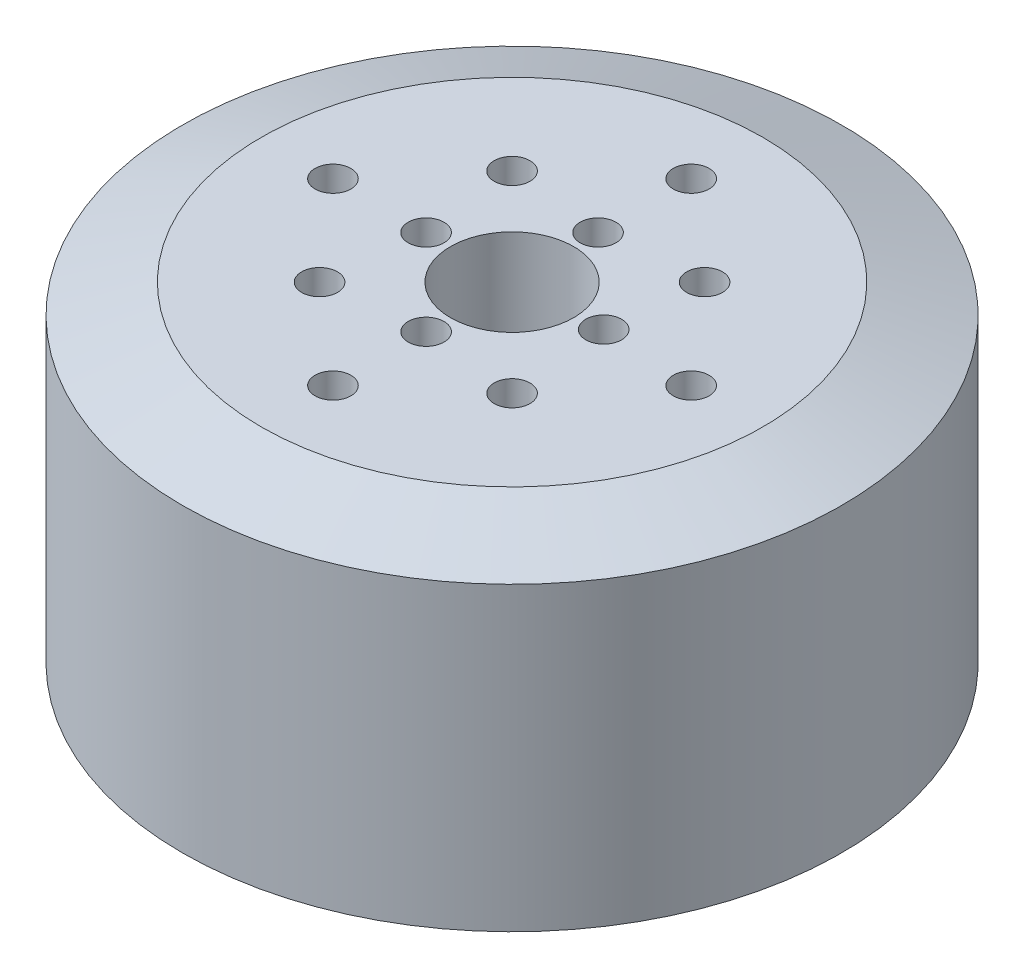
ISO-10303-21;
HEADER;
FILE_DESCRIPTION(('STEP AP214'),'2;1');
FILE_NAME('part.step','',(''),(''),'','','');
FILE_SCHEMA(('AUTOMOTIVE_DESIGN { 1 0 10303 214 1 1 1 1 }'));
ENDSEC;
DATA;
#1=APPLICATION_CONTEXT('core data for automotive mechanical design processes');
#2=APPLICATION_PROTOCOL_DEFINITION('international standard','automotive_design',2000,#1);
#3=PRODUCT_CONTEXT('',#1,'mechanical');
#4=PRODUCT('Part','Part','',(#3));
#5=PRODUCT_RELATED_PRODUCT_CATEGORY('part','',(#4));
#6=PRODUCT_DEFINITION_FORMATION('','',#4);
#7=PRODUCT_DEFINITION_CONTEXT('part definition',#1,'design');
#8=PRODUCT_DEFINITION('design','',#6,#7);
#9=PRODUCT_DEFINITION_SHAPE('','',#8);
#10=(LENGTH_UNIT() NAMED_UNIT(*) SI_UNIT(.MILLI.,.METRE.));
#11=(NAMED_UNIT(*) PLANE_ANGLE_UNIT() SI_UNIT($,.RADIAN.));
#12=(NAMED_UNIT(*) SI_UNIT($,.STERADIAN.) SOLID_ANGLE_UNIT());
#13=UNCERTAINTY_MEASURE_WITH_UNIT(LENGTH_MEASURE(1.E-05),#10,'distance_accuracy_value','');
#14=(GEOMETRIC_REPRESENTATION_CONTEXT(3) GLOBAL_UNCERTAINTY_ASSIGNED_CONTEXT((#13)) GLOBAL_UNIT_ASSIGNED_CONTEXT((#10,
#11,#12)) REPRESENTATION_CONTEXT('',''));
#15=CARTESIAN_POINT('',(0.,0.,0.));
#16=DIRECTION('',(0.,0.,1.));
#17=DIRECTION('',(1.,0.,0.));
#18=AXIS2_PLACEMENT_3D('',#15,#16,#17);
#19=CARTESIAN_POINT('',(0.,0.,0.));
#20=DIRECTION('',(0.,1.,0.));
#21=DIRECTION('',(0.,0.,1.));
#22=AXIS2_PLACEMENT_3D('',#19,#20,#21);
#23=CYLINDRICAL_SURFACE('',#22,3.5);
#24=CARTESIAN_POINT('',(0.,-9.,0.));
#25=DIRECTION('',(0.,1.,0.));
#26=DIRECTION('',(0.,0.,1.));
#27=AXIS2_PLACEMENT_3D('',#24,#25,#26);
#28=CIRCLE('',#27,3.5);
#29=CARTESIAN_POINT('',(0.,-9.,3.5));
#30=VERTEX_POINT('',#29);
#31=EDGE_CURVE('E162',#30,#30,#28,.T.);
#32=ORIENTED_EDGE('',*,*,#31,.F.);
#33=EDGE_LOOP('',(#32));
#34=FACE_BOUND('',#33,.T.);
#35=CARTESIAN_POINT('',(0.,-2.,0.));
#36=DIRECTION('',(0.,1.,0.));
#37=DIRECTION('',(0.,0.,1.));
#38=AXIS2_PLACEMENT_3D('',#35,#36,#37);
#39=CIRCLE('',#38,3.5);
#40=CARTESIAN_POINT('',(0.,-2.,3.5));
#41=VERTEX_POINT('',#40);
#42=EDGE_CURVE('E42',#41,#41,#39,.F.);
#43=ORIENTED_EDGE('',*,*,#42,.F.);
#44=EDGE_LOOP('',(#43));
#45=FACE_BOUND('',#44,.T.);
#46=ADVANCED_FACE('F38',(#34,#45),#23,.F.);
#47=CARTESIAN_POINT('',(0.,23.,0.));
#48=DIRECTION('',(0.,-1.,0.));
#49=DIRECTION('',(0.,0.,-1.));
#50=AXIS2_PLACEMENT_3D('',#47,#48,#49);
#51=CYLINDRICAL_SURFACE('',#50,23.);
#52=CARTESIAN_POINT('',(0.,21.,0.));
#53=DIRECTION('',(0.,1.,0.));
#54=DIRECTION('',(0.,0.,1.));
#55=AXIS2_PLACEMENT_3D('',#52,#53,#54);
#56=CIRCLE('',#55,23.);
#57=CARTESIAN_POINT('',(0.,21.,23.));
#58=VERTEX_POINT('',#57);
#59=EDGE_CURVE('E176',#58,#58,#56,.F.);
#60=ORIENTED_EDGE('',*,*,#59,.T.);
#61=EDGE_LOOP('',(#60));
#62=FACE_BOUND('',#61,.T.);
#63=CARTESIAN_POINT('',(0.,0.,0.));
#64=DIRECTION('',(0.,1.,0.));
#65=DIRECTION('',(0.,0.,1.));
#66=AXIS2_PLACEMENT_3D('',#63,#64,#65);
#67=CIRCLE('',#66,23.);
#68=CARTESIAN_POINT('',(0.,0.,23.));
#69=VERTEX_POINT('',#68);
#70=EDGE_CURVE('E170',#69,#69,#67,.T.);
#71=ORIENTED_EDGE('',*,*,#70,.T.);
#72=EDGE_LOOP('',(#71));
#73=FACE_BOUND('',#72,.T.);
#74=ADVANCED_FACE('F238',(#62,#73),#51,.T.);
#75=CARTESIAN_POINT('',(0.,23.,0.));
#76=DIRECTION('',(0.,1.,0.));
#77=DIRECTION('',(0.,0.,1.));
#78=AXIS2_PLACEMENT_3D('',#75,#76,#77);
#79=PLANE('',#78);
#80=CARTESIAN_POINT('',(0.,23.,0.));
#81=DIRECTION('',(0.,1.,0.));
#82=DIRECTION('',(0.,0.,1.));
#83=AXIS2_PLACEMENT_3D('',#80,#81,#82);
#84=CIRCLE('',#83,4.3);
#85=CARTESIAN_POINT('',(0.,23.,4.3));
#86=VERTEX_POINT('',#85);
#87=EDGE_CURVE('E494',#86,#86,#84,.T.);
#88=ORIENTED_EDGE('',*,*,#87,.F.);
#89=EDGE_LOOP('',(#88));
#90=FACE_BOUND('',#89,.T.);
#91=CARTESIAN_POINT('',(-6.7175144212721,23.,-6.71751442127231));
#92=DIRECTION('',(0.,1.,0.));
#93=DIRECTION('',(0.,0.,1.));
#94=AXIS2_PLACEMENT_3D('',#91,#92,#93);
#95=CIRCLE('',#94,1.24999999999999);
#96=CARTESIAN_POINT('',(-6.7175144212721,23.,-5.46751442127232));
#97=VERTEX_POINT('',#96);
#98=EDGE_CURVE('E483',#97,#97,#95,.T.);
#99=ORIENTED_EDGE('',*,*,#98,.F.);
#100=EDGE_LOOP('',(#99));
#101=FACE_BOUND('',#100,.T.);
#102=CARTESIAN_POINT('',(6.71751442127224,23.,-6.71751442127216));
#103=DIRECTION('',(0.,1.,0.));
#104=DIRECTION('',(0.,0.,1.));
#105=AXIS2_PLACEMENT_3D('',#102,#103,#104);
#106=CIRCLE('',#105,1.24999999999999);
#107=CARTESIAN_POINT('',(6.71751442127224,23.,-5.46751442127218));
#108=VERTEX_POINT('',#107);
#109=EDGE_CURVE('E480',#108,#108,#106,.T.);
#110=ORIENTED_EDGE('',*,*,#109,.F.);
#111=EDGE_LOOP('',(#110));
#112=FACE_BOUND('',#111,.T.);
#113=CARTESIAN_POINT('',(6.71751442127216,23.,6.71751442127224));
#114=DIRECTION('',(0.,1.,0.));
#115=DIRECTION('',(0.,0.,1.));
#116=AXIS2_PLACEMENT_3D('',#113,#114,#115);
#117=CIRCLE('',#116,1.24999999999999);
#118=CARTESIAN_POINT('',(6.71751442127216,23.,7.96751442127222));
#119=VERTEX_POINT('',#118);
#120=EDGE_CURVE('E477',#119,#119,#117,.T.);
#121=ORIENTED_EDGE('',*,*,#120,.F.);
#122=EDGE_LOOP('',(#121));
#123=FACE_BOUND('',#122,.T.);
#124=CARTESIAN_POINT('',(-6.71751442127224,23.,6.71751442127217));
#125=DIRECTION('',(0.,1.,0.));
#126=DIRECTION('',(0.,0.,1.));
#127=AXIS2_PLACEMENT_3D('',#124,#125,#126);
#128=CIRCLE('',#127,1.24999999999999);
#129=CARTESIAN_POINT('',(-6.71751442127224,23.,7.96751442127215));
#130=VERTEX_POINT('',#129);
#131=EDGE_CURVE('E473',#130,#130,#128,.T.);
#132=ORIENTED_EDGE('',*,*,#131,.F.);
#133=EDGE_LOOP('',(#132));
#134=FACE_BOUND('',#133,.T.);
#135=CARTESIAN_POINT('',(6.06215920614872,23.,-0.332038967862047));
#136=DIRECTION('',(0.,1.,0.));
#137=DIRECTION('',(0.,0.,1.));
#138=AXIS2_PLACEMENT_3D('',#135,#136,#137);
#139=CIRCLE('',#138,1.24999999999999);
#140=CARTESIAN_POINT('',(6.06215920614872,23.,0.917961032137942));
#141=VERTEX_POINT('',#140);
#142=EDGE_CURVE('E112',#141,#141,#139,.T.);
#143=ORIENTED_EDGE('',*,*,#142,.F.);
#144=EDGE_LOOP('',(#143));
#145=FACE_BOUND('',#144,.T.);
#146=CARTESIAN_POINT('',(0.,23.,-6.));
#147=DIRECTION('',(0.,1.,0.));
#148=DIRECTION('',(0.,0.,1.));
#149=AXIS2_PLACEMENT_3D('',#146,#147,#148);
#150=CIRCLE('',#149,1.24999999999999);
#151=CARTESIAN_POINT('',(0.,23.,-4.75000000000001));
#152=VERTEX_POINT('',#151);
#153=EDGE_CURVE('E120',#152,#152,#150,.T.);
#154=ORIENTED_EDGE('',*,*,#153,.F.);
#155=EDGE_LOOP('',(#154));
#156=FACE_BOUND('',#155,.T.);
#157=CARTESIAN_POINT('',(-6.,23.,0.));
#158=DIRECTION('',(0.,1.,0.));
#159=DIRECTION('',(0.,0.,1.));
#160=AXIS2_PLACEMENT_3D('',#157,#158,#159);
#161=CIRCLE('',#160,1.24999999999999);
#162=CARTESIAN_POINT('',(-6.,23.,1.24999999999999));
#163=VERTEX_POINT('',#162);
#164=EDGE_CURVE('E127',#163,#163,#161,.T.);
#165=ORIENTED_EDGE('',*,*,#164,.F.);
#166=EDGE_LOOP('',(#165));
#167=FACE_BOUND('',#166,.T.);
#168=CARTESIAN_POINT('',(0.,23.,6.));
#169=DIRECTION('',(0.,1.,0.));
#170=DIRECTION('',(0.,0.,1.));
#171=AXIS2_PLACEMENT_3D('',#168,#169,#170);
#172=CIRCLE('',#171,1.24999999999999);
#173=CARTESIAN_POINT('',(0.,23.,7.24999999999999));
#174=VERTEX_POINT('',#173);
#175=EDGE_CURVE('E132',#174,#174,#172,.T.);
#176=ORIENTED_EDGE('',*,*,#175,.F.);
#177=EDGE_LOOP('',(#176));
#178=FACE_BOUND('',#177,.T.);
#179=CARTESIAN_POINT('',(0.,23.,-12.5));
#180=DIRECTION('',(0.,1.,0.));
#181=DIRECTION('',(0.,0.,1.));
#182=AXIS2_PLACEMENT_3D('',#179,#180,#181);
#183=CIRCLE('',#182,1.24999999999999);
#184=CARTESIAN_POINT('',(0.,23.,-11.25));
#185=VERTEX_POINT('',#184);
#186=EDGE_CURVE('E137',#185,#185,#183,.T.);
#187=ORIENTED_EDGE('',*,*,#186,.F.);
#188=EDGE_LOOP('',(#187));
#189=FACE_BOUND('',#188,.T.);
#190=CARTESIAN_POINT('',(12.5,23.,0.));
#191=DIRECTION('',(0.,1.,0.));
#192=DIRECTION('',(0.,0.,1.));
#193=AXIS2_PLACEMENT_3D('',#190,#191,#192);
#194=CIRCLE('',#193,1.24999999999999);
#195=CARTESIAN_POINT('',(12.5,23.,1.24999999999999));
#196=VERTEX_POINT('',#195);
#197=EDGE_CURVE('E141',#196,#196,#194,.T.);
#198=ORIENTED_EDGE('',*,*,#197,.F.);
#199=EDGE_LOOP('',(#198));
#200=FACE_BOUND('',#199,.T.);
#201=CARTESIAN_POINT('',(0.,23.,12.5));
#202=DIRECTION('',(0.,1.,0.));
#203=DIRECTION('',(0.,0.,1.));
#204=AXIS2_PLACEMENT_3D('',#201,#202,#203);
#205=CIRCLE('',#204,1.24999999999999);
#206=CARTESIAN_POINT('',(0.,23.,13.75));
#207=VERTEX_POINT('',#206);
#208=EDGE_CURVE('E145',#207,#207,#205,.T.);
#209=ORIENTED_EDGE('',*,*,#208,.F.);
#210=EDGE_LOOP('',(#209));
#211=FACE_BOUND('',#210,.T.);
#212=CARTESIAN_POINT('',(-12.5,23.,0.));
#213=DIRECTION('',(0.,1.,0.));
#214=DIRECTION('',(0.,0.,1.));
#215=AXIS2_PLACEMENT_3D('',#212,#213,#214);
#216=CIRCLE('',#215,1.24999999999999);
#217=CARTESIAN_POINT('',(-12.5,23.,1.24999999999999));
#218=VERTEX_POINT('',#217);
#219=EDGE_CURVE('E149',#218,#218,#216,.T.);
#220=ORIENTED_EDGE('',*,*,#219,.F.);
#221=EDGE_LOOP('',(#220));
#222=FACE_BOUND('',#221,.T.);
#223=CARTESIAN_POINT('',(0.,23.,0.));
#224=DIRECTION('',(0.,1.,0.));
#225=DIRECTION('',(0.,0.,1.));
#226=AXIS2_PLACEMENT_3D('',#223,#224,#225);
#227=CIRCLE('',#226,17.5050451610907);
#228=CARTESIAN_POINT('',(0.,23.,17.5050451610907));
#229=VERTEX_POINT('',#228);
#230=EDGE_CURVE('E173',#229,#229,#227,.T.);
#231=ORIENTED_EDGE('',*,*,#230,.T.);
#232=EDGE_LOOP('',(#231));
#233=FACE_BOUND('',#232,.T.);
#234=ADVANCED_FACE('F243',(#90,#101,#112,#123,#134,#145,#156,#167,#178,#189,#200,#211,#222,
#233),#79,.T.);
#235=CARTESIAN_POINT('',(0.,0.,0.));
#236=DIRECTION('',(0.,1.,0.));
#237=DIRECTION('',(0.,0.,1.));
#238=AXIS2_PLACEMENT_3D('',#235,#236,#237);
#239=PLANE('',#238);
#240=CARTESIAN_POINT('',(0.,0.,0.));
#241=DIRECTION('',(0.,-1.,0.));
#242=DIRECTION('',(0.,0.,-1.));
#243=AXIS2_PLACEMENT_3D('',#240,#241,#242);
#244=CIRCLE('',#243,21.);
#245=CARTESIAN_POINT('',(0.,0.,-21.));
#246=VERTEX_POINT('',#245);
#247=EDGE_CURVE('E156',#246,#246,#244,.T.);
#248=ORIENTED_EDGE('',*,*,#247,.F.);
#249=EDGE_LOOP('',(#248));
#250=FACE_BOUND('',#249,.T.);
#251=ORIENTED_EDGE('',*,*,#70,.F.);
#252=EDGE_LOOP('',(#251));
#253=FACE_BOUND('',#252,.T.);
#254=ADVANCED_FACE('F250',(#250,#253),#239,.F.);
#255=CARTESIAN_POINT('',(0.,23.,0.));
#256=DIRECTION('',(0.,-1.,0.));
#257=DIRECTION('',(0.,0.,-1.));
#258=AXIS2_PLACEMENT_3D('',#255,#256,#257);
#259=CONICAL_SURFACE('',#258,17.5050451610907,1.22173047639603);
#260=ORIENTED_EDGE('',*,*,#59,.F.);
#261=EDGE_LOOP('',(#260));
#262=FACE_BOUND('',#261,.T.);
#263=ORIENTED_EDGE('',*,*,#230,.F.);
#264=EDGE_LOOP('',(#263));
#265=FACE_BOUND('',#264,.T.);
#266=ADVANCED_FACE('F40',(#262,#265),#259,.T.);
#267=CARTESIAN_POINT('',(0.,-9.,0.));
#268=DIRECTION('',(0.,1.,0.));
#269=DIRECTION('',(0.,0.,1.));
#270=AXIS2_PLACEMENT_3D('',#267,#268,#269);
#271=CYLINDRICAL_SURFACE('',#270,5.);
#272=DIRECTION('',(0.,1.,0.));
#273=VECTOR('',#272,1.);
#274=CARTESIAN_POINT('',(4.92648039244466,19.25,-0.854278024333036));
#275=LINE('',#274,#273);
#276=CARTESIAN_POINT('',(4.92648039244465,15.5,-0.854278024333037));
#277=VERTEX_POINT('',#276);
#278=CARTESIAN_POINT('',(4.92648039244466,19.,-0.854278024333036));
#279=VERTEX_POINT('',#278);
#280=EDGE_CURVE('E55',#277,#279,#275,.T.);
#281=ORIENTED_EDGE('',*,*,#280,.F.);
#282=CARTESIAN_POINT('',(4.99027501462058,15.5002000000004,0.311697414897239));
#283=CARTESIAN_POINT('',(4.99360552216487,15.4820059849964,0.258424595256702));
#284=CARTESIAN_POINT('',(4.99611722470376,15.4654009108554,0.204450863679389));
#285=CARTESIAN_POINT('',(4.99939543873086,15.4365060868304,0.0950931019042687));
#286=CARTESIAN_POINT('',(5.00015493933427,15.4242338385591,0.0397042996734908));
#287=CARTESIAN_POINT('',(4.99979978031538,15.4056763303057,-0.069880293194446));
#288=CARTESIAN_POINT('',(4.99875716836379,15.399175937336,-0.124038174089908));
#289=CARTESIAN_POINT('',(4.99488204454086,15.3921743451514,-0.232578303083335));
#290=CARTESIAN_POINT('',(4.99205335362825,15.3916603846934,-0.286959826621077));
#291=CARTESIAN_POINT('',(4.98538573684323,15.3961553094821,-0.384475003286181));
#292=CARTESIAN_POINT('',(4.98186155654648,15.4000812992085,-0.427685170301955));
#293=CARTESIAN_POINT('',(4.97374456704113,15.4114584673814,-0.513541004473429));
#294=CARTESIAN_POINT('',(4.96915149412868,15.4189105162028,-0.556186529579292));
#295=CARTESIAN_POINT('',(4.95879349089047,15.437127750021,-0.642108296478677));
#296=CARTESIAN_POINT('',(4.95299460868225,15.4479950713087,-0.68535819515262));
#297=CARTESIAN_POINT('',(4.94041083976459,15.4723121258251,-0.770845309424624));
#298=CARTESIAN_POINT('',(4.93362890828868,15.4857541565982,-0.813085133126015));
#299=CARTESIAN_POINT('',(4.92638007325319,15.5002000000053,-0.854856346910934));
#300=B_SPLINE_CURVE_WITH_KNOTS('',3,(#282,#283,#284,#285,#286,#287,#288,#289,#290,#291,#292,
#293,#294,#295,#296,#297,#298,#299),.UNSPECIFIED.,.F.,.F.,(4,2,2,2,2,2,2,2,4),(0.,
0.169301112032795,0.339278463055959,0.50261633672497,0.665605960122337,0.796031842358435,
0.926489935816234,1.06129563521788,1.19570417902296),.UNSPECIFIED.);
#301=CARTESIAN_POINT('',(4.99031157095918,15.5,0.311111595333371));
#302=VERTEX_POINT('',#301);
#303=EDGE_CURVE('E11',#302,#277,#300,.T.);
#304=ORIENTED_EDGE('',*,*,#303,.F.);
#305=DIRECTION('',(0.,1.,0.));
#306=VECTOR('',#305,1.);
#307=CARTESIAN_POINT('',(4.99031157095918,19.25,0.31111159533337));
#308=LINE('',#307,#306);
#309=CARTESIAN_POINT('',(4.99031157095918,19.,0.31111159533337));
#310=VERTEX_POINT('',#309);
#311=EDGE_CURVE('E111',#310,#302,#308,.F.);
#312=ORIENTED_EDGE('',*,*,#311,.F.);
#313=CARTESIAN_POINT('',(0.,19.,0.));
#314=DIRECTION('',(0.,-1.,0.));
#315=DIRECTION('',(0.,0.,-1.));
#316=AXIS2_PLACEMENT_3D('',#313,#314,#315);
#317=CIRCLE('',#316,5.);
#318=CARTESIAN_POINT('',(0.683046656074812,19.,4.953125));
#319=VERTEX_POINT('',#318);
#320=EDGE_CURVE('E158',#310,#319,#317,.T.);
#321=ORIENTED_EDGE('',*,*,#320,.T.);
#322=DIRECTION('',(0.,1.,0.));
#323=VECTOR('',#322,1.);
#324=CARTESIAN_POINT('',(0.683046656074812,19.25,4.953125));
#325=LINE('',#324,#323);
#326=CARTESIAN_POINT('',(0.683046656074819,15.5,4.953125));
#327=VERTEX_POINT('',#326);
#328=EDGE_CURVE('E598',#327,#319,#325,.T.);
#329=ORIENTED_EDGE('',*,*,#328,.F.);
#330=CARTESIAN_POINT('',(-0.68354939084132,15.5002,4.95305564578882));
#331=CARTESIAN_POINT('',(-0.63049596911567,15.4791312856344,4.96037548903329));
#332=CARTESIAN_POINT('',(-0.57673545863239,15.4593113819134,4.96692758343031));
#333=CARTESIAN_POINT('',(-0.467466646189805,15.4233891805751,4.97840509830115));
#334=CARTESIAN_POINT('',(-0.411949703203379,15.4073102251416,4.98332038360211));
#335=CARTESIAN_POINT('',(-0.300631984845447,15.3806547283435,4.99125875159246));
#336=CARTESIAN_POINT('',(-0.244860339074458,15.3699721824375,4.99431854560324));
#337=CARTESIAN_POINT('',(-0.132507045841449,15.3550078584312,4.99855861325173));
#338=CARTESIAN_POINT('',(-0.0759279808631046,15.3507089395087,4.99974392067491));
#339=CARTESIAN_POINT('',(0.0315230703155169,15.3492102636196,5.00015914885173));
#340=CARTESIAN_POINT('',(0.0823854156290366,15.3513278153558,4.99957709667599));
#341=CARTESIAN_POINT('',(0.183596368344055,15.3609297505612,4.9968849623259));
#342=CARTESIAN_POINT('',(0.233944371651127,15.3684198410474,4.99477325524132));
#343=CARTESIAN_POINT('',(0.333676678586855,15.3879331937142,4.98910406516098));
#344=CARTESIAN_POINT('',(0.383060286379363,15.3999596104679,4.98554557593474));
#345=CARTESIAN_POINT('',(0.480677992098879,15.4275336004237,4.97708239997955));
#346=CARTESIAN_POINT('',(0.528912478660019,15.4430799639412,4.97217817561104));
#347=CARTESIAN_POINT('',(0.594595391132845,15.4663124351049,4.96455282167522));
#348=CARTESIAN_POINT('',(0.612519621872725,15.4728682787442,4.96237277837279));
#349=CARTESIAN_POINT('',(0.648168900608865,15.4863000604369,4.95784216146103));
#350=CARTESIAN_POINT('',(0.66589436175369,15.4931750652896,4.95549207501973));
#351=CARTESIAN_POINT('',(0.683549390842156,15.5002000000003,4.9530556457887));
#352=B_SPLINE_CURVE_WITH_KNOTS('',3,(#330,#331,#332,#333,#334,#335,#336,#337,#338,#339,#340,
#341,#342,#343,#344,#345,#346,#347,#348,#349,#350,#351),.UNSPECIFIED.,.F.,.F.,(4,2,2,2,2,2,2,2,
2,2,4),(0.,0.172779897582075,0.346610579252038,0.516879087408299,0.686689571756135,
0.839089218335956,0.991650992713053,1.14431905512536,1.29693473019882,1.35456095359918,
1.41202816092007),.UNSPECIFIED.);
#353=CARTESIAN_POINT('',(-0.683046656074818,15.5,4.953125));
#354=VERTEX_POINT('',#353);
#355=EDGE_CURVE('E179',#354,#327,#352,.T.);
#356=ORIENTED_EDGE('',*,*,#355,.F.);
#357=DIRECTION('',(0.,1.,0.));
#358=VECTOR('',#357,1.);
#359=CARTESIAN_POINT('',(-0.683046656074812,19.25,4.953125));
#360=LINE('',#359,#358);
#361=CARTESIAN_POINT('',(-0.683046656074812,19.,4.953125));
#362=VERTEX_POINT('',#361);
#363=EDGE_CURVE('E194',#362,#354,#360,.F.);
#364=ORIENTED_EDGE('',*,*,#363,.F.);
#365=CARTESIAN_POINT('',(-4.953125,19.,0.683046656074812));
#366=VERTEX_POINT('',#365);
#367=EDGE_CURVE('E153',#362,#366,#317,.T.);
#368=ORIENTED_EDGE('',*,*,#367,.T.);
#369=DIRECTION('',(0.,1.,0.));
#370=VECTOR('',#369,1.);
#371=CARTESIAN_POINT('',(-4.953125,19.25,0.683046656074812));
#372=LINE('',#371,#370);
#373=CARTESIAN_POINT('',(-4.953125,15.5,0.683046656074819));
#374=VERTEX_POINT('',#373);
#375=EDGE_CURVE('E585',#374,#366,#372,.T.);
#376=ORIENTED_EDGE('',*,*,#375,.F.);
#377=CARTESIAN_POINT('',(-4.95305564578882,15.5002,-0.68354939084132));
#378=CARTESIAN_POINT('',(-4.96037548903329,15.4791312856344,-0.63049596911567));
#379=CARTESIAN_POINT('',(-4.96692758343031,15.4593113819134,-0.57673545863239));
#380=CARTESIAN_POINT('',(-4.97840509830115,15.4233891805751,-0.467466646189805));
#381=CARTESIAN_POINT('',(-4.98332038360211,15.4073102251416,-0.411949703203379));
#382=CARTESIAN_POINT('',(-4.99125875159246,15.3806547283435,-0.300631984845447));
#383=CARTESIAN_POINT('',(-4.99431854560324,15.3699721824375,-0.244860339074457));
#384=CARTESIAN_POINT('',(-4.99855861325173,15.3550078584312,-0.132507045841449));
#385=CARTESIAN_POINT('',(-4.99974392067491,15.3507089395087,-0.0759279808631038));
#386=CARTESIAN_POINT('',(-5.00015914885173,15.3492102636196,0.0315230703155177));
#387=CARTESIAN_POINT('',(-4.99957709667599,15.3513278153558,0.0823854156290372));
#388=CARTESIAN_POINT('',(-4.9968849623259,15.3609297505612,0.183596368344055));
#389=CARTESIAN_POINT('',(-4.99477325524132,15.3684198410474,0.233944371651127));
#390=CARTESIAN_POINT('',(-4.98910406516098,15.3879331937142,0.333676678586855));
#391=CARTESIAN_POINT('',(-4.98554557593474,15.3999596104679,0.383060286379362));
#392=CARTESIAN_POINT('',(-4.97708239997955,15.4275336004237,0.480677992098879));
#393=CARTESIAN_POINT('',(-4.97217817561104,15.4430799639412,0.528912478660018));
#394=CARTESIAN_POINT('',(-4.96455282167522,15.4663124351049,0.594595391132844));
#395=CARTESIAN_POINT('',(-4.96237277837279,15.4728682787442,0.612519621872725));
#396=CARTESIAN_POINT('',(-4.95784216146103,15.4863000604369,0.648168900608865));
#397=CARTESIAN_POINT('',(-4.95549207501973,15.4931750652896,0.665894361753689));
#398=CARTESIAN_POINT('',(-4.9530556457887,15.5002000000003,0.683549390842156));
#399=B_SPLINE_CURVE_WITH_KNOTS('',3,(#377,#378,#379,#380,#381,#382,#383,#384,#385,#386,#387,
#388,#389,#390,#391,#392,#393,#394,#395,#396,#397,#398),.UNSPECIFIED.,.F.,.F.,(4,2,2,2,2,2,2,2,
2,2,4),(0.,0.172779897582075,0.346610579252038,0.516879087408299,0.686689571756136,
0.839089218335956,0.991650992713053,1.14431905512536,1.29693473019881,1.35456095359918,
1.41202816092007),.UNSPECIFIED.);
#400=CARTESIAN_POINT('',(-4.953125,15.5,-0.683046656074818));
#401=VERTEX_POINT('',#400);
#402=EDGE_CURVE('E576',#401,#374,#399,.T.);
#403=ORIENTED_EDGE('',*,*,#402,.F.);
#404=DIRECTION('',(0.,1.,0.));
#405=VECTOR('',#404,1.);
#406=CARTESIAN_POINT('',(-4.953125,19.25,-0.683046656074812));
#407=LINE('',#406,#405);
#408=CARTESIAN_POINT('',(-4.953125,19.,-0.683046656074812));
#409=VERTEX_POINT('',#408);
#410=EDGE_CURVE('E582',#409,#401,#407,.F.);
#411=ORIENTED_EDGE('',*,*,#410,.F.);
#412=CARTESIAN_POINT('',(-0.683046656074812,19.,-4.953125));
#413=VERTEX_POINT('',#412);
#414=EDGE_CURVE('E157',#409,#413,#317,.T.);
#415=ORIENTED_EDGE('',*,*,#414,.T.);
#416=DIRECTION('',(0.,1.,0.));
#417=VECTOR('',#416,1.);
#418=CARTESIAN_POINT('',(-0.683046656074812,19.25,-4.953125));
#419=LINE('',#418,#417);
#420=CARTESIAN_POINT('',(-0.683046656074819,15.5,-4.953125));
#421=VERTEX_POINT('',#420);
#422=EDGE_CURVE('E561',#421,#413,#419,.T.);
#423=ORIENTED_EDGE('',*,*,#422,.F.);
#424=CARTESIAN_POINT('',(0.683549390842154,15.5002000000003,-4.9530556457887));
#425=CARTESIAN_POINT('',(0.63049596911649,15.4791312856348,-4.96037548903319));
#426=CARTESIAN_POINT('',(0.576735458633196,15.4593113819137,-4.96692758343021));
#427=CARTESIAN_POINT('',(0.467466646190582,15.4233891805754,-4.97840509830107));
#428=CARTESIAN_POINT('',(0.411949703204141,15.4073102251418,-4.98332038360204));
#429=CARTESIAN_POINT('',(0.300631984846175,15.3806547283436,-4.99125875159241));
#430=CARTESIAN_POINT('',(0.244860339075166,15.3699721824376,-4.9943185456032));
#431=CARTESIAN_POINT('',(0.132507045842115,15.3550078584312,-4.99855861325171));
#432=CARTESIAN_POINT('',(0.0759279808637474,15.3507089395087,-4.9997439206749));
#433=CARTESIAN_POINT('',(-0.0315230703149446,15.3492102636195,-5.00015914885173));
#434=CARTESIAN_POINT('',(-0.0823854156285113,15.3513278153558,-4.999577096676));
#435=CARTESIAN_POINT('',(-0.183596368343624,15.3609297505612,-4.99688496232592));
#436=CARTESIAN_POINT('',(-0.233944371650744,15.3684198410474,-4.99477325524133));
#437=CARTESIAN_POINT('',(-0.333676678586566,15.3879331937141,-4.989104065161));
#438=CARTESIAN_POINT('',(-0.383060286379119,15.3999596104678,-4.98554557593476));
#439=CARTESIAN_POINT('',(-0.480677992098724,15.4275336004236,-4.97708239997956));
#440=CARTESIAN_POINT('',(-0.528912478659907,15.4430799639412,-4.97217817561105));
#441=CARTESIAN_POINT('',(-0.594595391132645,15.4663124351048,-4.96455282167524));
#442=CARTESIAN_POINT('',(-0.612519621872397,15.4728682787441,-4.96237277837283));
#443=CARTESIAN_POINT('',(-0.648168900608282,15.4863000604367,-4.95784216146111));
#444=CARTESIAN_POINT('',(-0.66589436175298,15.4931750652893,-4.95549207501983));
#445=CARTESIAN_POINT('',(-0.683549390841322,15.5002,-4.95305564578882));
#446=B_SPLINE_CURVE_WITH_KNOTS('',3,(#424,#425,#426,#427,#428,#429,#430,#431,#432,#433,#434,
#435,#436,#437,#438,#439,#440,#441,#442,#443,#444,#445),.UNSPECIFIED.,.F.,.F.,(4,2,2,2,2,2,2,2,
2,2,4),(0.,0.172779897582143,0.346610579252174,0.51687908740851,0.686689571756422,
0.839089218336381,0.991650992713616,1.14431905512606,1.29693473019965,1.35456095359959,
1.41202816092007),.UNSPECIFIED.);
#447=CARTESIAN_POINT('',(0.683046656074818,15.5,-4.953125));
#448=VERTEX_POINT('',#447);
#449=EDGE_CURVE('E566',#448,#421,#446,.T.);
#450=ORIENTED_EDGE('',*,*,#449,.F.);
#451=DIRECTION('',(0.,1.,0.));
#452=VECTOR('',#451,1.);
#453=CARTESIAN_POINT('',(0.683046656074812,19.25,-4.953125));
#454=LINE('',#453,#452);
#455=CARTESIAN_POINT('',(0.683046656074812,19.,-4.953125));
#456=VERTEX_POINT('',#455);
#457=EDGE_CURVE('E562',#456,#448,#454,.F.);
#458=ORIENTED_EDGE('',*,*,#457,.F.);
#459=EDGE_CURVE('E119',#456,#279,#317,.T.);
#460=ORIENTED_EDGE('',*,*,#459,.T.);
#461=EDGE_LOOP('',(#281,#304,#312,#321,#329,#356,#364,#368,#376,#403,#411,#415,#423,#450,#458,#460));
#462=FACE_BOUND('',#461,.T.);
#463=CARTESIAN_POINT('',(0.,-9.,0.));
#464=DIRECTION('',(0.,1.,0.));
#465=DIRECTION('',(0.,0.,1.));
#466=AXIS2_PLACEMENT_3D('',#463,#464,#465);
#467=CIRCLE('',#466,5.);
#468=CARTESIAN_POINT('',(0.,-9.,5.));
#469=VERTEX_POINT('',#468);
#470=EDGE_CURVE('E167',#469,#469,#467,.T.);
#471=ORIENTED_EDGE('',*,*,#470,.T.);
#472=EDGE_LOOP('',(#471));
#473=FACE_BOUND('',#472,.T.);
#474=ADVANCED_FACE('F115',(#462,#473),#271,.T.);
#475=CARTESIAN_POINT('',(0.,-9.,0.));
#476=DIRECTION('',(0.,1.,0.));
#477=DIRECTION('',(0.,0.,1.));
#478=AXIS2_PLACEMENT_3D('',#475,#476,#477);
#479=PLANE('',#478);
#480=ORIENTED_EDGE('',*,*,#31,.T.);
#481=EDGE_LOOP('',(#480));
#482=FACE_BOUND('',#481,.T.);
#483=ORIENTED_EDGE('',*,*,#470,.F.);
#484=EDGE_LOOP('',(#483));
#485=FACE_BOUND('',#484,.T.);
#486=ADVANCED_FACE('F229',(#482,#485),#479,.F.);
#487=CARTESIAN_POINT('',(0.,19.,0.));
#488=DIRECTION('',(0.,-1.,0.));
#489=DIRECTION('',(0.,0.,-1.));
#490=AXIS2_PLACEMENT_3D('',#487,#488,#489);
#491=CYLINDRICAL_SURFACE('',#490,21.);
#492=CARTESIAN_POINT('',(0.,19.,0.));
#493=DIRECTION('',(0.,-1.,0.));
#494=DIRECTION('',(0.,0.,-1.));
#495=AXIS2_PLACEMENT_3D('',#492,#493,#494);
#496=CIRCLE('',#495,21.);
#497=CARTESIAN_POINT('',(0.,19.,-21.));
#498=VERTEX_POINT('',#497);
#499=EDGE_CURVE('E159',#498,#498,#496,.T.);
#500=ORIENTED_EDGE('',*,*,#499,.F.);
#501=EDGE_LOOP('',(#500));
#502=FACE_BOUND('',#501,.T.);
#503=ORIENTED_EDGE('',*,*,#247,.T.);
#504=EDGE_LOOP('',(#503));
#505=FACE_BOUND('',#504,.T.);
#506=ADVANCED_FACE('F226',(#502,#505),#491,.F.);
#507=CARTESIAN_POINT('',(0.,19.,0.));
#508=DIRECTION('',(0.,-1.,0.));
#509=DIRECTION('',(0.,0.,-1.));
#510=AXIS2_PLACEMENT_3D('',#507,#508,#509);
#511=PLANE('',#510);
#512=CARTESIAN_POINT('',(-6.7175144212721,19.,-6.71751442127231));
#513=DIRECTION('',(0.,-1.,0.));
#514=DIRECTION('',(0.,0.,-1.));
#515=AXIS2_PLACEMENT_3D('',#512,#513,#514);
#516=CIRCLE('',#515,1.24999999999999);
#517=CARTESIAN_POINT('',(-6.7175144212721,19.,-7.9675144212723));
#518=VERTEX_POINT('',#517);
#519=EDGE_CURVE('E481',#518,#518,#516,.T.);
#520=ORIENTED_EDGE('',*,*,#519,.F.);
#521=EDGE_LOOP('',(#520));
#522=FACE_BOUND('',#521,.T.);
#523=CARTESIAN_POINT('',(6.71751442127224,19.,-6.71751442127216));
#524=DIRECTION('',(0.,-1.,0.));
#525=DIRECTION('',(0.,0.,-1.));
#526=AXIS2_PLACEMENT_3D('',#523,#524,#525);
#527=CIRCLE('',#526,1.24999999999999);
#528=CARTESIAN_POINT('',(6.71751442127224,19.,-7.96751442127215));
#529=VERTEX_POINT('',#528);
#530=EDGE_CURVE('E478',#529,#529,#527,.T.);
#531=ORIENTED_EDGE('',*,*,#530,.F.);
#532=EDGE_LOOP('',(#531));
#533=FACE_BOUND('',#532,.T.);
#534=CARTESIAN_POINT('',(6.71751442127216,19.,6.71751442127224));
#535=DIRECTION('',(0.,-1.,0.));
#536=DIRECTION('',(0.,0.,-1.));
#537=AXIS2_PLACEMENT_3D('',#534,#535,#536);
#538=CIRCLE('',#537,1.24999999999999);
#539=CARTESIAN_POINT('',(6.71751442127216,19.,5.46751442127225));
#540=VERTEX_POINT('',#539);
#541=EDGE_CURVE('E474',#540,#540,#538,.T.);
#542=ORIENTED_EDGE('',*,*,#541,.F.);
#543=EDGE_LOOP('',(#542));
#544=FACE_BOUND('',#543,.T.);
#545=CARTESIAN_POINT('',(-6.71751442127224,19.,6.71751442127217));
#546=DIRECTION('',(0.,-1.,0.));
#547=DIRECTION('',(0.,0.,-1.));
#548=AXIS2_PLACEMENT_3D('',#545,#546,#547);
#549=CIRCLE('',#548,1.24999999999999);
#550=CARTESIAN_POINT('',(-6.71751442127224,19.,5.46751442127218));
#551=VERTEX_POINT('',#550);
#552=EDGE_CURVE('E470',#551,#551,#549,.T.);
#553=ORIENTED_EDGE('',*,*,#552,.F.);
#554=EDGE_LOOP('',(#553));
#555=FACE_BOUND('',#554,.T.);
#556=CARTESIAN_POINT('',(6.06215920614872,19.,-0.332038967862047));
#557=DIRECTION('',(0.,-1.,0.));
#558=DIRECTION('',(0.,0.,-1.));
#559=AXIS2_PLACEMENT_3D('',#556,#557,#558);
#560=CIRCLE('',#559,1.24999999999999);
#561=EDGE_CURVE('E47',#279,#310,#560,.T.);
#562=ORIENTED_EDGE('',*,*,#561,.F.);
#563=ORIENTED_EDGE('',*,*,#459,.F.);
#564=CARTESIAN_POINT('',(0.,19.,-6.));
#565=DIRECTION('',(0.,-1.,0.));
#566=DIRECTION('',(0.,0.,-1.));
#567=AXIS2_PLACEMENT_3D('',#564,#565,#566);
#568=CIRCLE('',#567,1.24999999999999);
#569=EDGE_CURVE('E560',#413,#456,#568,.T.);
#570=ORIENTED_EDGE('',*,*,#569,.F.);
#571=ORIENTED_EDGE('',*,*,#414,.F.);
#572=CARTESIAN_POINT('',(-6.,19.,0.));
#573=DIRECTION('',(0.,-1.,0.));
#574=DIRECTION('',(0.,0.,-1.));
#575=AXIS2_PLACEMENT_3D('',#572,#573,#574);
#576=CIRCLE('',#575,1.24999999999999);
#577=EDGE_CURVE('E571',#366,#409,#576,.T.);
#578=ORIENTED_EDGE('',*,*,#577,.F.);
#579=ORIENTED_EDGE('',*,*,#367,.F.);
#580=CARTESIAN_POINT('',(0.,19.,6.));
#581=DIRECTION('',(0.,-1.,0.));
#582=DIRECTION('',(0.,0.,-1.));
#583=AXIS2_PLACEMENT_3D('',#580,#581,#582);
#584=CIRCLE('',#583,1.24999999999999);
#585=EDGE_CURVE('E583',#319,#362,#584,.T.);
#586=ORIENTED_EDGE('',*,*,#585,.F.);
#587=ORIENTED_EDGE('',*,*,#320,.F.);
#588=EDGE_LOOP('',(#562,#563,#570,#571,#578,#579,#586,#587));
#589=FACE_BOUND('',#588,.T.);
#590=CARTESIAN_POINT('',(0.,19.,-12.5));
#591=DIRECTION('',(0.,-1.,0.));
#592=DIRECTION('',(0.,0.,-1.));
#593=AXIS2_PLACEMENT_3D('',#590,#591,#592);
#594=CIRCLE('',#593,1.24999999999999);
#595=CARTESIAN_POINT('',(0.,19.,-13.75));
#596=VERTEX_POINT('',#595);
#597=EDGE_CURVE('E140',#596,#596,#594,.T.);
#598=ORIENTED_EDGE('',*,*,#597,.F.);
#599=EDGE_LOOP('',(#598));
#600=FACE_BOUND('',#599,.T.);
#601=CARTESIAN_POINT('',(12.5,19.,0.));
#602=DIRECTION('',(0.,-1.,0.));
#603=DIRECTION('',(0.,0.,-1.));
#604=AXIS2_PLACEMENT_3D('',#601,#602,#603);
#605=CIRCLE('',#604,1.24999999999999);
#606=CARTESIAN_POINT('',(12.5,19.,-1.24999999999999));
#607=VERTEX_POINT('',#606);
#608=EDGE_CURVE('E144',#607,#607,#605,.T.);
#609=ORIENTED_EDGE('',*,*,#608,.F.);
#610=EDGE_LOOP('',(#609));
#611=FACE_BOUND('',#610,.T.);
#612=CARTESIAN_POINT('',(0.,19.,12.5));
#613=DIRECTION('',(0.,-1.,0.));
#614=DIRECTION('',(0.,0.,-1.));
#615=AXIS2_PLACEMENT_3D('',#612,#613,#614);
#616=CIRCLE('',#615,1.24999999999999);
#617=CARTESIAN_POINT('',(0.,19.,11.25));
#618=VERTEX_POINT('',#617);
#619=EDGE_CURVE('E148',#618,#618,#616,.T.);
#620=ORIENTED_EDGE('',*,*,#619,.F.);
#621=EDGE_LOOP('',(#620));
#622=FACE_BOUND('',#621,.T.);
#623=CARTESIAN_POINT('',(-12.5,19.,0.));
#624=DIRECTION('',(0.,-1.,0.));
#625=DIRECTION('',(0.,0.,-1.));
#626=AXIS2_PLACEMENT_3D('',#623,#624,#625);
#627=CIRCLE('',#626,1.24999999999999);
#628=CARTESIAN_POINT('',(-12.5,19.,-1.24999999999999));
#629=VERTEX_POINT('',#628);
#630=EDGE_CURVE('E152',#629,#629,#627,.T.);
#631=ORIENTED_EDGE('',*,*,#630,.F.);
#632=EDGE_LOOP('',(#631));
#633=FACE_BOUND('',#632,.T.);
#634=ORIENTED_EDGE('',*,*,#499,.T.);
#635=EDGE_LOOP('',(#634));
#636=FACE_BOUND('',#635,.T.);
#637=ADVANCED_FACE('F222',(#522,#533,#544,#555,#589,#600,#611,#622,#633,#636),#511,.T.);
#638=CARTESIAN_POINT('',(-12.5,23.,0.));
#639=DIRECTION('',(0.,1.,0.));
#640=DIRECTION('',(0.,0.,1.));
#641=AXIS2_PLACEMENT_3D('',#638,#639,#640);
#642=CYLINDRICAL_SURFACE('',#641,1.24999999999999);
#643=ORIENTED_EDGE('',*,*,#630,.T.);
#644=EDGE_LOOP('',(#643));
#645=FACE_BOUND('',#644,.T.);
#646=ORIENTED_EDGE('',*,*,#219,.T.);
#647=EDGE_LOOP('',(#646));
#648=FACE_BOUND('',#647,.T.);
#649=ADVANCED_FACE('F218',(#645,#648),#642,.F.);
#650=CARTESIAN_POINT('',(0.,23.,12.5));
#651=DIRECTION('',(0.,1.,0.));
#652=DIRECTION('',(0.,0.,1.));
#653=AXIS2_PLACEMENT_3D('',#650,#651,#652);
#654=CYLINDRICAL_SURFACE('',#653,1.24999999999999);
#655=ORIENTED_EDGE('',*,*,#619,.T.);
#656=EDGE_LOOP('',(#655));
#657=FACE_BOUND('',#656,.T.);
#658=ORIENTED_EDGE('',*,*,#208,.T.);
#659=EDGE_LOOP('',(#658));
#660=FACE_BOUND('',#659,.T.);
#661=ADVANCED_FACE('F214',(#657,#660),#654,.F.);
#662=CARTESIAN_POINT('',(12.5,23.,0.));
#663=DIRECTION('',(0.,1.,0.));
#664=DIRECTION('',(0.,0.,1.));
#665=AXIS2_PLACEMENT_3D('',#662,#663,#664);
#666=CYLINDRICAL_SURFACE('',#665,1.24999999999999);
#667=ORIENTED_EDGE('',*,*,#608,.T.);
#668=EDGE_LOOP('',(#667));
#669=FACE_BOUND('',#668,.T.);
#670=ORIENTED_EDGE('',*,*,#197,.T.);
#671=EDGE_LOOP('',(#670));
#672=FACE_BOUND('',#671,.T.);
#673=ADVANCED_FACE('F210',(#669,#672),#666,.F.);
#674=CARTESIAN_POINT('',(0.,23.,-12.5));
#675=DIRECTION('',(0.,1.,0.));
#676=DIRECTION('',(0.,0.,1.));
#677=AXIS2_PLACEMENT_3D('',#674,#675,#676);
#678=CYLINDRICAL_SURFACE('',#677,1.24999999999999);
#679=ORIENTED_EDGE('',*,*,#597,.T.);
#680=EDGE_LOOP('',(#679));
#681=FACE_BOUND('',#680,.T.);
#682=ORIENTED_EDGE('',*,*,#186,.T.);
#683=EDGE_LOOP('',(#682));
#684=FACE_BOUND('',#683,.T.);
#685=ADVANCED_FACE('F205',(#681,#684),#678,.F.);
#686=CARTESIAN_POINT('',(0.,15.5,6.));
#687=DIRECTION('',(0.,1.,0.));
#688=DIRECTION('',(0.,0.,1.));
#689=AXIS2_PLACEMENT_3D('',#686,#687,#688);
#690=CONICAL_SURFACE('',#689,1.25,1.02974425867665);
#691=ORIENTED_EDGE('',*,*,#355,.T.);
#692=CARTESIAN_POINT('',(0.,15.5,6.));
#693=DIRECTION('',(0.,1.,0.));
#694=DIRECTION('',(0.,0.,1.));
#695=AXIS2_PLACEMENT_3D('',#692,#693,#694);
#696=CIRCLE('',#695,1.25);
#697=EDGE_CURVE('E135',#327,#354,#696,.T.);
#698=ORIENTED_EDGE('',*,*,#697,.T.);
#699=EDGE_LOOP('',(#691,#698));
#700=FACE_BOUND('',#699,.T.);
#701=ADVANCED_FACE('F199',(#700),#690,.F.);
#702=CARTESIAN_POINT('',(0.,23.,6.));
#703=DIRECTION('',(0.,1.,0.));
#704=DIRECTION('',(0.,0.,1.));
#705=AXIS2_PLACEMENT_3D('',#702,#703,#704);
#706=CYLINDRICAL_SURFACE('',#705,1.24999999999999);
#707=ORIENTED_EDGE('',*,*,#328,.T.);
#708=ORIENTED_EDGE('',*,*,#585,.T.);
#709=ORIENTED_EDGE('',*,*,#363,.T.);
#710=ORIENTED_EDGE('',*,*,#697,.F.);
#711=EDGE_LOOP('',(#707,#708,#709,#710));
#712=FACE_BOUND('',#711,.T.);
#713=ORIENTED_EDGE('',*,*,#175,.T.);
#714=EDGE_LOOP('',(#713));
#715=FACE_BOUND('',#714,.T.);
#716=ADVANCED_FACE('F204',(#712,#715),#706,.F.);
#717=CARTESIAN_POINT('',(-6.,15.5,0.));
#718=DIRECTION('',(0.,1.,0.));
#719=DIRECTION('',(0.,0.,1.));
#720=AXIS2_PLACEMENT_3D('',#717,#718,#719);
#721=CONICAL_SURFACE('',#720,1.25,1.02974425867665);
#722=ORIENTED_EDGE('',*,*,#402,.T.);
#723=CARTESIAN_POINT('',(-6.,15.5,0.));
#724=DIRECTION('',(0.,1.,0.));
#725=DIRECTION('',(0.,0.,1.));
#726=AXIS2_PLACEMENT_3D('',#723,#724,#725);
#727=CIRCLE('',#726,1.25);
#728=EDGE_CURVE('E130',#374,#401,#727,.T.);
#729=ORIENTED_EDGE('',*,*,#728,.T.);
#730=EDGE_LOOP('',(#722,#729));
#731=FACE_BOUND('',#730,.T.);
#732=ADVANCED_FACE('F298',(#731),#721,.F.);
#733=CARTESIAN_POINT('',(-6.,23.,0.));
#734=DIRECTION('',(0.,1.,0.));
#735=DIRECTION('',(0.,0.,1.));
#736=AXIS2_PLACEMENT_3D('',#733,#734,#735);
#737=CYLINDRICAL_SURFACE('',#736,1.24999999999999);
#738=ORIENTED_EDGE('',*,*,#375,.T.);
#739=ORIENTED_EDGE('',*,*,#577,.T.);
#740=ORIENTED_EDGE('',*,*,#410,.T.);
#741=ORIENTED_EDGE('',*,*,#728,.F.);
#742=EDGE_LOOP('',(#738,#739,#740,#741));
#743=FACE_BOUND('',#742,.T.);
#744=ORIENTED_EDGE('',*,*,#164,.T.);
#745=EDGE_LOOP('',(#744));
#746=FACE_BOUND('',#745,.T.);
#747=ADVANCED_FACE('F310',(#743,#746),#737,.F.);
#748=CARTESIAN_POINT('',(0.,15.5,-6.));
#749=DIRECTION('',(0.,1.,0.));
#750=DIRECTION('',(0.,0.,1.));
#751=AXIS2_PLACEMENT_3D('',#748,#749,#750);
#752=CONICAL_SURFACE('',#751,1.25,1.02974425867665);
#753=ORIENTED_EDGE('',*,*,#449,.T.);
#754=CARTESIAN_POINT('',(0.,15.5,-6.));
#755=DIRECTION('',(0.,1.,0.));
#756=DIRECTION('',(0.,0.,1.));
#757=AXIS2_PLACEMENT_3D('',#754,#755,#756);
#758=CIRCLE('',#757,1.25);
#759=EDGE_CURVE('E62',#421,#448,#758,.T.);
#760=ORIENTED_EDGE('',*,*,#759,.T.);
#761=EDGE_LOOP('',(#753,#760));
#762=FACE_BOUND('',#761,.T.);
#763=ADVANCED_FACE('F319',(#762),#752,.F.);
#764=CARTESIAN_POINT('',(0.,23.,-6.));
#765=DIRECTION('',(0.,1.,0.));
#766=DIRECTION('',(0.,0.,1.));
#767=AXIS2_PLACEMENT_3D('',#764,#765,#766);
#768=CYLINDRICAL_SURFACE('',#767,1.24999999999999);
#769=ORIENTED_EDGE('',*,*,#422,.T.);
#770=ORIENTED_EDGE('',*,*,#569,.T.);
#771=ORIENTED_EDGE('',*,*,#457,.T.);
#772=ORIENTED_EDGE('',*,*,#759,.F.);
#773=EDGE_LOOP('',(#769,#770,#771,#772));
#774=FACE_BOUND('',#773,.T.);
#775=ORIENTED_EDGE('',*,*,#153,.T.);
#776=EDGE_LOOP('',(#775));
#777=FACE_BOUND('',#776,.T.);
#778=ADVANCED_FACE('F331',(#774,#777),#768,.F.);
#779=CARTESIAN_POINT('',(6.06215920614872,15.5,-0.332038967862047));
#780=DIRECTION('',(0.,1.,0.));
#781=DIRECTION('',(0.,0.,1.));
#782=AXIS2_PLACEMENT_3D('',#779,#780,#781);
#783=CONICAL_SURFACE('',#782,1.25,1.02974425867665);
#784=ORIENTED_EDGE('',*,*,#303,.T.);
#785=CARTESIAN_POINT('',(6.06215920614872,15.5,-0.332038967862047));
#786=DIRECTION('',(0.,1.,0.));
#787=DIRECTION('',(0.,0.,1.));
#788=AXIS2_PLACEMENT_3D('',#785,#786,#787);
#789=CIRCLE('',#788,1.25);
#790=EDGE_CURVE('E106',#277,#302,#789,.T.);
#791=ORIENTED_EDGE('',*,*,#790,.T.);
#792=EDGE_LOOP('',(#784,#791));
#793=FACE_BOUND('',#792,.T.);
#794=ADVANCED_FACE('F105',(#793),#783,.F.);
#795=CARTESIAN_POINT('',(6.06215920614872,23.,-0.332038967862047));
#796=DIRECTION('',(0.,1.,0.));
#797=DIRECTION('',(0.,0.,1.));
#798=AXIS2_PLACEMENT_3D('',#795,#796,#797);
#799=CYLINDRICAL_SURFACE('',#798,1.24999999999999);
#800=ORIENTED_EDGE('',*,*,#280,.T.);
#801=ORIENTED_EDGE('',*,*,#561,.T.);
#802=ORIENTED_EDGE('',*,*,#311,.T.);
#803=ORIENTED_EDGE('',*,*,#790,.F.);
#804=EDGE_LOOP('',(#800,#801,#802,#803));
#805=FACE_BOUND('',#804,.T.);
#806=ORIENTED_EDGE('',*,*,#142,.T.);
#807=EDGE_LOOP('',(#806));
#808=FACE_BOUND('',#807,.T.);
#809=ADVANCED_FACE('F109',(#805,#808),#799,.F.);
#810=CARTESIAN_POINT('',(-6.71751442127224,23.,6.71751442127217));
#811=DIRECTION('',(0.,1.,0.));
#812=DIRECTION('',(0.,0.,1.));
#813=AXIS2_PLACEMENT_3D('',#810,#811,#812);
#814=CYLINDRICAL_SURFACE('',#813,1.24999999999999);
#815=ORIENTED_EDGE('',*,*,#552,.T.);
#816=EDGE_LOOP('',(#815));
#817=FACE_BOUND('',#816,.T.);
#818=ORIENTED_EDGE('',*,*,#131,.T.);
#819=EDGE_LOOP('',(#818));
#820=FACE_BOUND('',#819,.T.);
#821=ADVANCED_FACE('F359',(#817,#820),#814,.F.);
#822=CARTESIAN_POINT('',(6.71751442127216,23.,6.71751442127224));
#823=DIRECTION('',(0.,1.,0.));
#824=DIRECTION('',(0.,0.,1.));
#825=AXIS2_PLACEMENT_3D('',#822,#823,#824);
#826=CYLINDRICAL_SURFACE('',#825,1.24999999999999);
#827=ORIENTED_EDGE('',*,*,#541,.T.);
#828=EDGE_LOOP('',(#827));
#829=FACE_BOUND('',#828,.T.);
#830=ORIENTED_EDGE('',*,*,#120,.T.);
#831=EDGE_LOOP('',(#830));
#832=FACE_BOUND('',#831,.T.);
#833=ADVANCED_FACE('F378',(#829,#832),#826,.F.);
#834=CARTESIAN_POINT('',(6.71751442127224,23.,-6.71751442127216));
#835=DIRECTION('',(0.,1.,0.));
#836=DIRECTION('',(0.,0.,1.));
#837=AXIS2_PLACEMENT_3D('',#834,#835,#836);
#838=CYLINDRICAL_SURFACE('',#837,1.24999999999999);
#839=ORIENTED_EDGE('',*,*,#530,.T.);
#840=EDGE_LOOP('',(#839));
#841=FACE_BOUND('',#840,.T.);
#842=ORIENTED_EDGE('',*,*,#109,.T.);
#843=EDGE_LOOP('',(#842));
#844=FACE_BOUND('',#843,.T.);
#845=ADVANCED_FACE('F390',(#841,#844),#838,.F.);
#846=CARTESIAN_POINT('',(-6.7175144212721,23.,-6.71751442127231));
#847=DIRECTION('',(0.,1.,0.));
#848=DIRECTION('',(0.,0.,1.));
#849=AXIS2_PLACEMENT_3D('',#846,#847,#848);
#850=CYLINDRICAL_SURFACE('',#849,1.24999999999999);
#851=ORIENTED_EDGE('',*,*,#519,.T.);
#852=EDGE_LOOP('',(#851));
#853=FACE_BOUND('',#852,.T.);
#854=ORIENTED_EDGE('',*,*,#98,.T.);
#855=EDGE_LOOP('',(#854));
#856=FACE_BOUND('',#855,.T.);
#857=ADVANCED_FACE('F401',(#853,#856),#850,.F.);
#858=CARTESIAN_POINT('',(0.,-2.,0.));
#859=DIRECTION('',(0.,1.,0.));
#860=DIRECTION('',(0.,0.,1.));
#861=AXIS2_PLACEMENT_3D('',#858,#859,#860);
#862=PLANE('',#861);
#863=CARTESIAN_POINT('',(0.,-2.,0.));
#864=DIRECTION('',(0.,1.,0.));
#865=DIRECTION('',(0.,0.,1.));
#866=AXIS2_PLACEMENT_3D('',#863,#864,#865);
#867=CIRCLE('',#866,4.3);
#868=CARTESIAN_POINT('',(0.,-2.,4.3));
#869=VERTEX_POINT('',#868);
#870=EDGE_CURVE('E492',#869,#869,#867,.T.);
#871=ORIENTED_EDGE('',*,*,#870,.T.);
#872=EDGE_LOOP('',(#871));
#873=FACE_BOUND('',#872,.T.);
#874=ORIENTED_EDGE('',*,*,#42,.T.);
#875=EDGE_LOOP('',(#874));
#876=FACE_BOUND('',#875,.T.);
#877=ADVANCED_FACE('F410',(#873,#876),#862,.T.);
#878=CARTESIAN_POINT('',(0.,-2.,0.));
#879=DIRECTION('',(0.,1.,0.));
#880=DIRECTION('',(0.,0.,1.));
#881=AXIS2_PLACEMENT_3D('',#878,#879,#880);
#882=CYLINDRICAL_SURFACE('',#881,4.3);
#883=ORIENTED_EDGE('',*,*,#870,.F.);
#884=EDGE_LOOP('',(#883));
#885=FACE_BOUND('',#884,.T.);
#886=ORIENTED_EDGE('',*,*,#87,.T.);
#887=EDGE_LOOP('',(#886));
#888=FACE_BOUND('',#887,.T.);
#889=ADVANCED_FACE('F434',(#885,#888),#882,.F.);
#890=CLOSED_SHELL('',(#46,#74,#234,#254,#266,#474,#486,#506,#637,#649,#661,#673,#685,#701,#716,
#732,#747,#763,#778,#794,#809,#821,#833,#845,#857,#877,#889));
#891=MANIFOLD_SOLID_BREP('B2',#890);
#892=ADVANCED_BREP_SHAPE_REPRESENTATION('',(#18,#891),#14);
#893=SHAPE_DEFINITION_REPRESENTATION(#9,#892);
ENDSEC;
END-ISO-10303-21;
